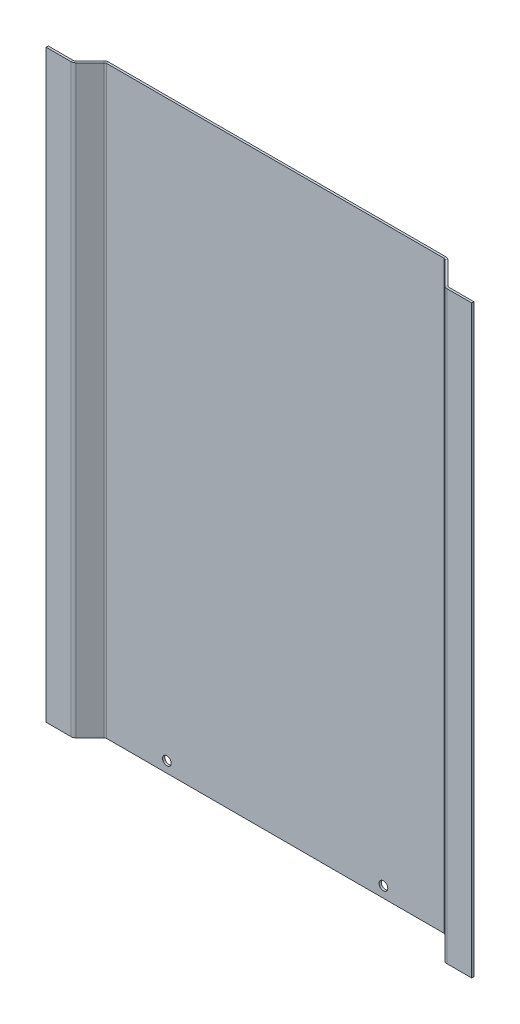
ISO-10303-21;
HEADER;
FILE_DESCRIPTION(('STEP AP214'),'2;1');
FILE_NAME('part.step','',(''),(''),'','','');
FILE_SCHEMA(('AUTOMOTIVE_DESIGN { 1 0 10303 214 1 1 1 1 }'));
ENDSEC;
DATA;
#1=APPLICATION_CONTEXT('core data for automotive mechanical design processes');
#2=APPLICATION_PROTOCOL_DEFINITION('international standard','automotive_design',2000,#1);
#3=PRODUCT_CONTEXT('',#1,'mechanical');
#4=PRODUCT('Part','Part','',(#3));
#5=PRODUCT_RELATED_PRODUCT_CATEGORY('part','',(#4));
#6=PRODUCT_DEFINITION_FORMATION('','',#4);
#7=PRODUCT_DEFINITION_CONTEXT('part definition',#1,'design');
#8=PRODUCT_DEFINITION('design','',#6,#7);
#9=PRODUCT_DEFINITION_SHAPE('','',#8);
#10=(LENGTH_UNIT() NAMED_UNIT(*) SI_UNIT(.MILLI.,.METRE.));
#11=(NAMED_UNIT(*) PLANE_ANGLE_UNIT() SI_UNIT($,.RADIAN.));
#12=(NAMED_UNIT(*) SI_UNIT($,.STERADIAN.) SOLID_ANGLE_UNIT());
#13=UNCERTAINTY_MEASURE_WITH_UNIT(LENGTH_MEASURE(1.E-05),#10,'distance_accuracy_value','');
#14=(GEOMETRIC_REPRESENTATION_CONTEXT(3) GLOBAL_UNCERTAINTY_ASSIGNED_CONTEXT((#13)) GLOBAL_UNIT_ASSIGNED_CONTEXT((#10,
#11,#12)) REPRESENTATION_CONTEXT('',''));
#15=CARTESIAN_POINT('',(0.,0.,0.));
#16=DIRECTION('',(0.,0.,1.));
#17=DIRECTION('',(1.,0.,0.));
#18=AXIS2_PLACEMENT_3D('',#15,#16,#17);
#19=CARTESIAN_POINT('',(-177.752027260435,270.,50.1485281374239));
#20=DIRECTION('',(0.,1.,0.));
#21=DIRECTION('',(0.,0.,1.));
#22=AXIS2_PLACEMENT_3D('',#19,#20,#21);
#23=PLANE('',#22);
#24=DIRECTION('',(0.707106781186547,0.,0.707106781186547));
#25=VECTOR('',#24,1.);
#26=CARTESIAN_POINT('',(-177.752027260435,270.,50.1485281374239));
#27=LINE('',#26,#25);
#28=CARTESIAN_POINT('',(-177.752027260435,270.,50.1485281374239));
#29=VERTEX_POINT('',#28);
#30=CARTESIAN_POINT('',(-177.044920479248,270.,50.8556349186104));
#31=VERTEX_POINT('',#30);
#32=EDGE_CURVE('E11',#29,#31,#27,.T.);
#33=ORIENTED_EDGE('',*,*,#32,.F.);
#34=CARTESIAN_POINT('',(-178.600555397859,270.,49.3));
#35=DIRECTION('',(0.,-1.,0.));
#36=DIRECTION('',(0.,0.,-1.));
#37=AXIS2_PLACEMENT_3D('',#34,#35,#36);
#38=CIRCLE('',#37,1.2);
#39=CARTESIAN_POINT('',(-178.600555397859,270.,50.5));
#40=VERTEX_POINT('',#39);
#41=EDGE_CURVE('E364',#40,#29,#38,.F.);
#42=ORIENTED_EDGE('',*,*,#41,.F.);
#43=DIRECTION('',(0.,0.,-1.));
#44=VECTOR('',#43,1.);
#45=CARTESIAN_POINT('',(-178.600555397859,270.,51.5));
#46=LINE('',#45,#44);
#47=CARTESIAN_POINT('',(-178.600555397859,270.,51.5));
#48=VERTEX_POINT('',#47);
#49=EDGE_CURVE('E42',#48,#40,#46,.T.);
#50=ORIENTED_EDGE('',*,*,#49,.F.);
#51=CARTESIAN_POINT('',(-178.600555397859,270.,49.3));
#52=DIRECTION('',(0.,1.,0.));
#53=DIRECTION('',(1.,0.,0.));
#54=AXIS2_PLACEMENT_3D('',#51,#52,#53);
#55=CIRCLE('',#54,2.2);
#56=EDGE_CURVE('E377',#48,#31,#55,.T.);
#57=ORIENTED_EDGE('',*,*,#56,.T.);
#58=EDGE_LOOP('',(#33,#42,#50,#57));
#59=FACE_BOUND('',#58,.T.);
#60=ADVANCED_FACE('F34',(#59),#23,.T.);
#61=CARTESIAN_POINT('',(-178.600555397859,270.,51.5));
#62=DIRECTION('',(0.,1.,0.));
#63=DIRECTION('',(0.,0.,1.));
#64=AXIS2_PLACEMENT_3D('',#61,#62,#63);
#65=PLANE('',#64);
#66=DIRECTION('',(0.707106781186547,0.,-0.707106781186548));
#67=VECTOR('',#66,1.);
#68=CARTESIAN_POINT('',(-178.103499123011,270.,50.5));
#69=LINE('',#68,#67);
#70=CARTESIAN_POINT('',(-171.247864204401,270.,43.6443650813896));
#71=VERTEX_POINT('',#70);
#72=EDGE_CURVE('E368',#29,#71,#69,.T.);
#73=ORIENTED_EDGE('',*,*,#72,.F.);
#74=ORIENTED_EDGE('',*,*,#32,.T.);
#75=DIRECTION('',(0.707106781186547,0.,-0.707106781186548));
#76=VECTOR('',#75,1.);
#77=CARTESIAN_POINT('',(-177.396392341825,270.,51.2071067811865));
#78=LINE('',#77,#76);
#79=CARTESIAN_POINT('',(-170.540757423214,270.,44.3514718625761));
#80=VERTEX_POINT('',#79);
#81=EDGE_CURVE('E379',#31,#80,#78,.T.);
#82=ORIENTED_EDGE('',*,*,#81,.T.);
#83=DIRECTION('',(-0.707106781186547,0.,-0.707106781186547));
#84=VECTOR('',#83,1.);
#85=CARTESIAN_POINT('',(-170.540757423214,270.,44.3514718625761));
#86=LINE('',#85,#84);
#87=EDGE_CURVE('E338',#80,#71,#86,.T.);
#88=ORIENTED_EDGE('',*,*,#87,.T.);
#89=EDGE_LOOP('',(#73,#74,#82,#88));
#90=FACE_BOUND('',#89,.T.);
#91=ADVANCED_FACE('F449',(#90),#65,.T.);
#92=CARTESIAN_POINT('',(-178.600555397859,0.,50.5));
#93=DIRECTION('',(0.,-1.,0.));
#94=DIRECTION('',(0.,0.,-1.));
#95=AXIS2_PLACEMENT_3D('',#92,#93,#94);
#96=PLANE('',#95);
#97=DIRECTION('',(0.,0.,1.));
#98=VECTOR('',#97,1.);
#99=CARTESIAN_POINT('',(-178.600555397859,0.,50.5));
#100=LINE('',#99,#98);
#101=CARTESIAN_POINT('',(-178.600555397859,0.,50.5));
#102=VERTEX_POINT('',#101);
#103=CARTESIAN_POINT('',(-178.600555397859,0.,51.5));
#104=VERTEX_POINT('',#103);
#105=EDGE_CURVE('E344',#102,#104,#100,.T.);
#106=ORIENTED_EDGE('',*,*,#105,.F.);
#107=CARTESIAN_POINT('',(-178.600555397859,0.,49.3));
#108=DIRECTION('',(0.,-1.,0.));
#109=DIRECTION('',(0.,0.,-1.));
#110=AXIS2_PLACEMENT_3D('',#107,#108,#109);
#111=CIRCLE('',#110,1.2);
#112=CARTESIAN_POINT('',(-177.752027260435,0.,50.1485281374239));
#113=VERTEX_POINT('',#112);
#114=EDGE_CURVE('E248',#102,#113,#111,.F.);
#115=ORIENTED_EDGE('',*,*,#114,.T.);
#116=DIRECTION('',(-0.707106781186547,0.,-0.707106781186547));
#117=VECTOR('',#116,1.);
#118=CARTESIAN_POINT('',(-177.044920479248,0.,50.8556349186104));
#119=LINE('',#118,#117);
#120=CARTESIAN_POINT('',(-177.044920479248,0.,50.8556349186104));
#121=VERTEX_POINT('',#120);
#122=EDGE_CURVE('E342',#121,#113,#119,.T.);
#123=ORIENTED_EDGE('',*,*,#122,.F.);
#124=CARTESIAN_POINT('',(-178.600555397859,0.,49.3));
#125=DIRECTION('',(0.,1.,0.));
#126=DIRECTION('',(1.,0.,0.));
#127=AXIS2_PLACEMENT_3D('',#124,#125,#126);
#128=CIRCLE('',#127,2.2);
#129=EDGE_CURVE('E260',#104,#121,#128,.T.);
#130=ORIENTED_EDGE('',*,*,#129,.F.);
#131=EDGE_LOOP('',(#106,#115,#123,#130));
#132=FACE_BOUND('',#131,.T.);
#133=ADVANCED_FACE('F491',(#132),#96,.T.);
#134=CARTESIAN_POINT('',(-177.044920479248,0.,50.8556349186104));
#135=DIRECTION('',(0.,-1.,0.));
#136=DIRECTION('',(0.,0.,-1.));
#137=AXIS2_PLACEMENT_3D('',#134,#135,#136);
#138=PLANE('',#137);
#139=DIRECTION('',(1.,0.,0.));
#140=VECTOR('',#139,1.);
#141=CARTESIAN_POINT('',(-178.103499123011,0.,50.5));
#142=LINE('',#141,#140);
#143=CARTESIAN_POINT('',(-190.103499123011,0.,50.5));
#144=VERTEX_POINT('',#143);
#145=EDGE_CURVE('E251',#144,#102,#142,.T.);
#146=ORIENTED_EDGE('',*,*,#145,.T.);
#147=ORIENTED_EDGE('',*,*,#105,.T.);
#148=DIRECTION('',(1.,0.,0.));
#149=VECTOR('',#148,1.);
#150=CARTESIAN_POINT('',(-178.103499123011,0.,51.5));
#151=LINE('',#150,#149);
#152=CARTESIAN_POINT('',(-190.103499123011,0.,51.5));
#153=VERTEX_POINT('',#152);
#154=EDGE_CURVE('E257',#153,#104,#151,.T.);
#155=ORIENTED_EDGE('',*,*,#154,.F.);
#156=DIRECTION('',(0.,0.,-1.));
#157=VECTOR('',#156,1.);
#158=CARTESIAN_POINT('',(-190.103499123011,0.,51.5));
#159=LINE('',#158,#157);
#160=EDGE_CURVE('E254',#153,#144,#159,.T.);
#161=ORIENTED_EDGE('',*,*,#160,.T.);
#162=EDGE_LOOP('',(#146,#147,#155,#161));
#163=FACE_BOUND('',#162,.T.);
#164=ADVANCED_FACE('F495',(#163),#138,.T.);
#165=CARTESIAN_POINT('',(-169.69222928579,270.,43.));
#166=DIRECTION('',(0.,1.,0.));
#167=DIRECTION('',(0.,0.,1.));
#168=AXIS2_PLACEMENT_3D('',#165,#166,#167);
#169=PLANE('',#168);
#170=DIRECTION('',(0.,0.,1.));
#171=VECTOR('',#170,1.);
#172=CARTESIAN_POINT('',(-169.69222928579,270.,43.));
#173=LINE('',#172,#171);
#174=CARTESIAN_POINT('',(-169.69222928579,270.,43.));
#175=VERTEX_POINT('',#174);
#176=CARTESIAN_POINT('',(-169.69222928579,270.,44.));
#177=VERTEX_POINT('',#176);
#178=EDGE_CURVE('E340',#175,#177,#173,.T.);
#179=ORIENTED_EDGE('',*,*,#178,.F.);
#180=CARTESIAN_POINT('',(-169.69222928579,270.,45.2));
#181=DIRECTION('',(0.,1.,0.));
#182=DIRECTION('',(0.,0.,1.));
#183=AXIS2_PLACEMENT_3D('',#180,#181,#182);
#184=CIRCLE('',#183,2.2);
#185=EDGE_CURVE('E439',#71,#175,#184,.F.);
#186=ORIENTED_EDGE('',*,*,#185,.F.);
#187=ORIENTED_EDGE('',*,*,#87,.F.);
#188=CARTESIAN_POINT('',(-169.69222928579,270.,45.2));
#189=DIRECTION('',(0.,1.,0.));
#190=DIRECTION('',(1.,0.,0.));
#191=AXIS2_PLACEMENT_3D('',#188,#189,#190);
#192=CIRCLE('',#191,1.2);
#193=EDGE_CURVE('E382',#80,#177,#192,.F.);
#194=ORIENTED_EDGE('',*,*,#193,.T.);
#195=EDGE_LOOP('',(#179,#186,#187,#194));
#196=FACE_BOUND('',#195,.T.);
#197=ADVANCED_FACE('F456',(#196),#169,.T.);
#198=CARTESIAN_POINT('',(-170.540757423214,270.,44.3514718625761));
#199=DIRECTION('',(0.,1.,0.));
#200=DIRECTION('',(0.,0.,1.));
#201=AXIS2_PLACEMENT_3D('',#198,#199,#200);
#202=PLANE('',#201);
#203=DIRECTION('',(1.,0.,0.));
#204=VECTOR('',#203,1.);
#205=CARTESIAN_POINT('',(-170.603499123011,270.,43.));
#206=LINE('',#205,#204);
#207=CARTESIAN_POINT('',(-14.0071930094071,270.,43.));
#208=VERTEX_POINT('',#207);
#209=EDGE_CURVE('E436',#175,#208,#206,.T.);
#210=ORIENTED_EDGE('',*,*,#209,.F.);
#211=ORIENTED_EDGE('',*,*,#178,.T.);
#212=DIRECTION('',(1.,0.,0.));
#213=VECTOR('',#212,1.);
#214=CARTESIAN_POINT('',(-170.603499123011,270.,44.));
#215=LINE('',#214,#213);
#216=CARTESIAN_POINT('',(-14.0071930094071,270.,44.));
#217=VERTEX_POINT('',#216);
#218=EDGE_CURVE('E201',#177,#217,#215,.T.);
#219=ORIENTED_EDGE('',*,*,#218,.T.);
#220=DIRECTION('',(0.,0.,-1.));
#221=VECTOR('',#220,1.);
#222=CARTESIAN_POINT('',(-14.0071930094071,270.,44.));
#223=LINE('',#222,#221);
#224=EDGE_CURVE('E192',#217,#208,#223,.T.);
#225=ORIENTED_EDGE('',*,*,#224,.T.);
#226=EDGE_LOOP('',(#210,#211,#219,#225));
#227=FACE_BOUND('',#226,.T.);
#228=ADVANCED_FACE('F388',(#227),#202,.T.);
#229=CARTESIAN_POINT('',(-171.247864204401,0.,43.6443650813896));
#230=DIRECTION('',(0.,-1.,0.));
#231=DIRECTION('',(0.,0.,-1.));
#232=AXIS2_PLACEMENT_3D('',#229,#230,#231);
#233=PLANE('',#232);
#234=DIRECTION('',(0.707106781186547,0.,0.707106781186547));
#235=VECTOR('',#234,1.);
#236=CARTESIAN_POINT('',(-171.247864204401,0.,43.6443650813896));
#237=LINE('',#236,#235);
#238=CARTESIAN_POINT('',(-171.247864204401,0.,43.6443650813896));
#239=VERTEX_POINT('',#238);
#240=CARTESIAN_POINT('',(-170.540757423214,0.,44.3514718625761));
#241=VERTEX_POINT('',#240);
#242=EDGE_CURVE('E336',#239,#241,#237,.T.);
#243=ORIENTED_EDGE('',*,*,#242,.F.);
#244=CARTESIAN_POINT('',(-169.69222928579,0.,45.2));
#245=DIRECTION('',(0.,1.,0.));
#246=DIRECTION('',(0.,0.,1.));
#247=AXIS2_PLACEMENT_3D('',#244,#245,#246);
#248=CIRCLE('',#247,2.2);
#249=CARTESIAN_POINT('',(-169.69222928579,0.,43.));
#250=VERTEX_POINT('',#249);
#251=EDGE_CURVE('E242',#239,#250,#248,.F.);
#252=ORIENTED_EDGE('',*,*,#251,.T.);
#253=DIRECTION('',(0.,0.,-1.));
#254=VECTOR('',#253,1.);
#255=CARTESIAN_POINT('',(-169.69222928579,0.,44.));
#256=LINE('',#255,#254);
#257=CARTESIAN_POINT('',(-169.69222928579,0.,44.));
#258=VERTEX_POINT('',#257);
#259=EDGE_CURVE('E191',#258,#250,#256,.T.);
#260=ORIENTED_EDGE('',*,*,#259,.F.);
#261=CARTESIAN_POINT('',(-169.69222928579,0.,45.2));
#262=DIRECTION('',(0.,1.,0.));
#263=DIRECTION('',(1.,0.,0.));
#264=AXIS2_PLACEMENT_3D('',#261,#262,#263);
#265=CIRCLE('',#264,1.2);
#266=EDGE_CURVE('E266',#241,#258,#265,.F.);
#267=ORIENTED_EDGE('',*,*,#266,.F.);
#268=EDGE_LOOP('',(#243,#252,#260,#267));
#269=FACE_BOUND('',#268,.T.);
#270=ADVANCED_FACE('F465',(#269),#233,.T.);
#271=CARTESIAN_POINT('',(-169.69222928579,0.,44.));
#272=DIRECTION('',(0.,-1.,0.));
#273=DIRECTION('',(0.,0.,-1.));
#274=AXIS2_PLACEMENT_3D('',#271,#272,#273);
#275=PLANE('',#274);
#276=DIRECTION('',(0.707106781186547,0.,-0.707106781186548));
#277=VECTOR('',#276,1.);
#278=CARTESIAN_POINT('',(-178.103499123011,0.,50.5));
#279=LINE('',#278,#277);
#280=EDGE_CURVE('E245',#113,#239,#279,.T.);
#281=ORIENTED_EDGE('',*,*,#280,.T.);
#282=ORIENTED_EDGE('',*,*,#242,.T.);
#283=DIRECTION('',(0.707106781186547,0.,-0.707106781186548));
#284=VECTOR('',#283,1.);
#285=CARTESIAN_POINT('',(-177.396392341825,0.,51.2071067811865));
#286=LINE('',#285,#284);
#287=EDGE_CURVE('E263',#121,#241,#286,.T.);
#288=ORIENTED_EDGE('',*,*,#287,.F.);
#289=ORIENTED_EDGE('',*,*,#122,.T.);
#290=EDGE_LOOP('',(#281,#282,#288,#289));
#291=FACE_BOUND('',#290,.T.);
#292=ADVANCED_FACE('F469',(#291),#275,.T.);
#293=CARTESIAN_POINT('',(-12.4515580907966,270.,43.6443650813895));
#294=DIRECTION('',(0.,1.,0.));
#295=DIRECTION('',(0.,0.,1.));
#296=AXIS2_PLACEMENT_3D('',#293,#294,#295);
#297=PLANE('',#296);
#298=DIRECTION('',(-0.707106781186549,0.,0.707106781186546));
#299=VECTOR('',#298,1.);
#300=CARTESIAN_POINT('',(-12.4515580907966,270.,43.6443650813895));
#301=LINE('',#300,#299);
#302=CARTESIAN_POINT('',(-12.4515580907966,270.,43.6443650813895));
#303=VERTEX_POINT('',#302);
#304=CARTESIAN_POINT('',(-13.1586648719831,270.,44.3514718625761));
#305=VERTEX_POINT('',#304);
#306=EDGE_CURVE('E179',#303,#305,#301,.T.);
#307=ORIENTED_EDGE('',*,*,#306,.F.);
#308=CARTESIAN_POINT('',(-14.007193009407,270.,45.2));
#309=DIRECTION('',(0.,1.,0.));
#310=DIRECTION('',(0.,0.,1.));
#311=AXIS2_PLACEMENT_3D('',#308,#309,#310);
#312=CIRCLE('',#311,2.2);
#313=EDGE_CURVE('E400',#208,#303,#312,.F.);
#314=ORIENTED_EDGE('',*,*,#313,.F.);
#315=ORIENTED_EDGE('',*,*,#224,.F.);
#316=CARTESIAN_POINT('',(-14.007193009407,270.,45.2));
#317=DIRECTION('',(0.,1.,0.));
#318=DIRECTION('',(1.,0.,0.));
#319=AXIS2_PLACEMENT_3D('',#316,#317,#318);
#320=CIRCLE('',#319,1.2);
#321=EDGE_CURVE('E195',#217,#305,#320,.F.);
#322=ORIENTED_EDGE('',*,*,#321,.T.);
#323=EDGE_LOOP('',(#307,#314,#315,#322));
#324=FACE_BOUND('',#323,.T.);
#325=ADVANCED_FACE('F197',(#324),#297,.T.);
#326=CARTESIAN_POINT('',(-14.0071930094071,270.,44.));
#327=DIRECTION('',(0.,1.,0.));
#328=DIRECTION('',(0.,0.,1.));
#329=AXIS2_PLACEMENT_3D('',#326,#327,#328);
#330=PLANE('',#329);
#331=DIRECTION('',(0.707106781186547,0.,0.707106781186548));
#332=VECTOR('',#331,1.);
#333=CARTESIAN_POINT('',(-13.0959231721861,270.,43.));
#334=LINE('',#333,#332);
#335=CARTESIAN_POINT('',(-1.94739503476221,270.,54.1485281374239));
#336=VERTEX_POINT('',#335);
#337=EDGE_CURVE('E186',#303,#336,#334,.T.);
#338=ORIENTED_EDGE('',*,*,#337,.F.);
#339=ORIENTED_EDGE('',*,*,#306,.T.);
#340=DIRECTION('',(0.707106781186547,0.,0.707106781186548));
#341=VECTOR('',#340,1.);
#342=CARTESIAN_POINT('',(-13.8030299533727,270.,43.7071067811865));
#343=LINE('',#342,#341);
#344=CARTESIAN_POINT('',(-2.65450181594875,270.,54.8556349186105));
#345=VERTEX_POINT('',#344);
#346=EDGE_CURVE('E183',#305,#345,#343,.T.);
#347=ORIENTED_EDGE('',*,*,#346,.T.);
#348=DIRECTION('',(0.707106781186548,0.,-0.707106781186547));
#349=VECTOR('',#348,1.);
#350=CARTESIAN_POINT('',(-2.65450181594875,270.,54.8556349186105));
#351=LINE('',#350,#349);
#352=EDGE_CURVE('E327',#345,#336,#351,.T.);
#353=ORIENTED_EDGE('',*,*,#352,.T.);
#354=EDGE_LOOP('',(#338,#339,#347,#353));
#355=FACE_BOUND('',#354,.T.);
#356=ADVANCED_FACE('F181',(#355),#330,.T.);
#357=CARTESIAN_POINT('',(-14.0071930094071,0.,43.));
#358=DIRECTION('',(0.,-1.,0.));
#359=DIRECTION('',(0.,0.,-1.));
#360=AXIS2_PLACEMENT_3D('',#357,#358,#359);
#361=PLANE('',#360);
#362=DIRECTION('',(0.,0.,1.));
#363=VECTOR('',#362,1.);
#364=CARTESIAN_POINT('',(-14.0071930094071,0.,43.));
#365=LINE('',#364,#363);
#366=CARTESIAN_POINT('',(-14.0071930094071,0.,43.));
#367=VERTEX_POINT('',#366);
#368=CARTESIAN_POINT('',(-14.0071930094071,0.,44.));
#369=VERTEX_POINT('',#368);
#370=EDGE_CURVE('E332',#367,#369,#365,.T.);
#371=ORIENTED_EDGE('',*,*,#370,.F.);
#372=CARTESIAN_POINT('',(-14.007193009407,0.,45.2));
#373=DIRECTION('',(0.,1.,0.));
#374=DIRECTION('',(0.,0.,1.));
#375=AXIS2_PLACEMENT_3D('',#372,#373,#374);
#376=CIRCLE('',#375,2.2);
#377=CARTESIAN_POINT('',(-12.4515580907966,0.,43.6443650813895));
#378=VERTEX_POINT('',#377);
#379=EDGE_CURVE('E236',#367,#378,#376,.F.);
#380=ORIENTED_EDGE('',*,*,#379,.T.);
#381=DIRECTION('',(0.707106781186549,0.,-0.707106781186546));
#382=VECTOR('',#381,1.);
#383=CARTESIAN_POINT('',(-13.1586648719831,0.,44.3514718625761));
#384=LINE('',#383,#382);
#385=CARTESIAN_POINT('',(-13.1586648719831,0.,44.3514718625761));
#386=VERTEX_POINT('',#385);
#387=EDGE_CURVE('E330',#386,#378,#384,.T.);
#388=ORIENTED_EDGE('',*,*,#387,.F.);
#389=CARTESIAN_POINT('',(-14.007193009407,0.,45.2));
#390=DIRECTION('',(0.,1.,0.));
#391=DIRECTION('',(1.,0.,0.));
#392=AXIS2_PLACEMENT_3D('',#389,#390,#391);
#393=CIRCLE('',#392,1.2);
#394=EDGE_CURVE('E208',#369,#386,#393,.F.);
#395=ORIENTED_EDGE('',*,*,#394,.F.);
#396=EDGE_LOOP('',(#371,#380,#388,#395));
#397=FACE_BOUND('',#396,.T.);
#398=ADVANCED_FACE('F394',(#397),#361,.T.);
#399=CARTESIAN_POINT('',(-13.1586648719831,0.,44.3514718625761));
#400=DIRECTION('',(0.,-1.,0.));
#401=DIRECTION('',(0.,0.,-1.));
#402=AXIS2_PLACEMENT_3D('',#399,#400,#401);
#403=PLANE('',#402);
#404=DIRECTION('',(1.,0.,0.));
#405=VECTOR('',#404,1.);
#406=CARTESIAN_POINT('',(-170.603499123011,0.,43.));
#407=LINE('',#406,#405);
#408=EDGE_CURVE('E239',#250,#367,#407,.T.);
#409=ORIENTED_EDGE('',*,*,#408,.T.);
#410=ORIENTED_EDGE('',*,*,#370,.T.);
#411=DIRECTION('',(1.,0.,0.));
#412=VECTOR('',#411,1.);
#413=CARTESIAN_POINT('',(-170.603499123011,0.,44.));
#414=LINE('',#413,#412);
#415=EDGE_CURVE('E269',#258,#369,#414,.T.);
#416=ORIENTED_EDGE('',*,*,#415,.F.);
#417=ORIENTED_EDGE('',*,*,#259,.T.);
#418=EDGE_LOOP('',(#409,#410,#416,#417));
#419=FACE_BOUND('',#418,.T.);
#420=ADVANCED_FACE('F475',(#419),#403,.T.);
#421=CARTESIAN_POINT('',(-1.09886689733835,270.,54.5000000000001));
#422=DIRECTION('',(0.,1.,0.));
#423=DIRECTION('',(0.,0.,1.));
#424=AXIS2_PLACEMENT_3D('',#421,#422,#423);
#425=PLANE('',#424);
#426=DIRECTION('',(0.,0.,1.));
#427=VECTOR('',#426,1.);
#428=CARTESIAN_POINT('',(-1.09886689733835,270.,54.5000000000001));
#429=LINE('',#428,#427);
#430=CARTESIAN_POINT('',(-1.09886689733835,270.,54.5000000000001));
#431=VERTEX_POINT('',#430);
#432=CARTESIAN_POINT('',(-1.09886689733835,270.,55.5000000000001));
#433=VERTEX_POINT('',#432);
#434=EDGE_CURVE('E50',#431,#433,#429,.T.);
#435=ORIENTED_EDGE('',*,*,#434,.F.);
#436=CARTESIAN_POINT('',(-1.09886689733835,270.,53.3000000000001));
#437=DIRECTION('',(0.,-1.,0.));
#438=DIRECTION('',(0.,0.,-1.));
#439=AXIS2_PLACEMENT_3D('',#436,#437,#438);
#440=CIRCLE('',#439,1.2);
#441=EDGE_CURVE('E428',#336,#431,#440,.F.);
#442=ORIENTED_EDGE('',*,*,#441,.F.);
#443=ORIENTED_EDGE('',*,*,#352,.F.);
#444=CARTESIAN_POINT('',(-1.09886689733835,270.,53.3000000000001));
#445=DIRECTION('',(0.,1.,0.));
#446=DIRECTION('',(1.,0.,0.));
#447=AXIS2_PLACEMENT_3D('',#444,#445,#446);
#448=CIRCLE('',#447,2.2);
#449=EDGE_CURVE('E216',#345,#433,#448,.T.);
#450=ORIENTED_EDGE('',*,*,#449,.T.);
#451=EDGE_LOOP('',(#435,#442,#443,#450));
#452=FACE_BOUND('',#451,.T.);
#453=ADVANCED_FACE('F477',(#452),#425,.T.);
#454=CARTESIAN_POINT('',(-2.65450181594875,270.,54.8556349186105));
#455=DIRECTION('',(0.,1.,0.));
#456=DIRECTION('',(0.,0.,1.));
#457=AXIS2_PLACEMENT_3D('',#454,#455,#456);
#458=PLANE('',#457);
#459=DIRECTION('',(1.,0.,0.));
#460=VECTOR('',#459,1.);
#461=CARTESIAN_POINT('',(-1.59592317218606,270.,54.5000000000001));
#462=LINE('',#461,#460);
#463=CARTESIAN_POINT('',(10.4040768278139,270.,54.5000000000001));
#464=VERTEX_POINT('',#463);
#465=EDGE_CURVE('E426',#431,#464,#462,.T.);
#466=ORIENTED_EDGE('',*,*,#465,.F.);
#467=ORIENTED_EDGE('',*,*,#434,.T.);
#468=DIRECTION('',(1.,0.,0.));
#469=VECTOR('',#468,1.);
#470=CARTESIAN_POINT('',(-1.59592317218606,270.,55.5000000000001));
#471=LINE('',#470,#469);
#472=CARTESIAN_POINT('',(10.4040768278139,270.,55.5000000000001));
#473=VERTEX_POINT('',#472);
#474=EDGE_CURVE('E128',#433,#473,#471,.T.);
#475=ORIENTED_EDGE('',*,*,#474,.T.);
#476=DIRECTION('',(0.,0.,1.));
#477=VECTOR('',#476,1.);
#478=CARTESIAN_POINT('',(10.4040768278139,270.,54.5000000000001));
#479=LINE('',#478,#477);
#480=EDGE_CURVE('E424',#464,#473,#479,.T.);
#481=ORIENTED_EDGE('',*,*,#480,.F.);
#482=EDGE_LOOP('',(#466,#467,#475,#481));
#483=FACE_BOUND('',#482,.T.);
#484=ADVANCED_FACE('F483',(#483),#458,.T.);
#485=CARTESIAN_POINT('',(-1.94739503476221,0.,54.1485281374239));
#486=DIRECTION('',(0.,-1.,0.));
#487=DIRECTION('',(0.,0.,-1.));
#488=AXIS2_PLACEMENT_3D('',#485,#486,#487);
#489=PLANE('',#488);
#490=DIRECTION('',(-0.707106781186548,0.,0.707106781186547));
#491=VECTOR('',#490,1.);
#492=CARTESIAN_POINT('',(-1.94739503476221,0.,54.1485281374239));
#493=LINE('',#492,#491);
#494=CARTESIAN_POINT('',(-1.94739503476221,0.,54.1485281374239));
#495=VERTEX_POINT('',#494);
#496=CARTESIAN_POINT('',(-2.65450181594875,0.,54.8556349186105));
#497=VERTEX_POINT('',#496);
#498=EDGE_CURVE('E115',#495,#497,#493,.T.);
#499=ORIENTED_EDGE('',*,*,#498,.F.);
#500=CARTESIAN_POINT('',(-1.09886689733835,0.,53.3000000000001));
#501=DIRECTION('',(0.,-1.,0.));
#502=DIRECTION('',(0.,0.,-1.));
#503=AXIS2_PLACEMENT_3D('',#500,#501,#502);
#504=CIRCLE('',#503,1.2);
#505=CARTESIAN_POINT('',(-1.09886689733835,0.,54.5000000000001));
#506=VERTEX_POINT('',#505);
#507=EDGE_CURVE('E232',#495,#506,#504,.F.);
#508=ORIENTED_EDGE('',*,*,#507,.T.);
#509=DIRECTION('',(0.,0.,-1.));
#510=VECTOR('',#509,1.);
#511=CARTESIAN_POINT('',(-1.09886689733835,0.,55.5000000000001));
#512=LINE('',#511,#510);
#513=CARTESIAN_POINT('',(-1.09886689733835,0.,55.5000000000001));
#514=VERTEX_POINT('',#513);
#515=EDGE_CURVE('E122',#514,#506,#512,.T.);
#516=ORIENTED_EDGE('',*,*,#515,.F.);
#517=CARTESIAN_POINT('',(-1.09886689733835,0.,53.3000000000001));
#518=DIRECTION('',(0.,1.,0.));
#519=DIRECTION('',(1.,0.,0.));
#520=AXIS2_PLACEMENT_3D('',#517,#518,#519);
#521=CIRCLE('',#520,2.2);
#522=EDGE_CURVE('E275',#497,#514,#521,.T.);
#523=ORIENTED_EDGE('',*,*,#522,.F.);
#524=EDGE_LOOP('',(#499,#508,#516,#523));
#525=FACE_BOUND('',#524,.T.);
#526=ADVANCED_FACE('F411',(#525),#489,.T.);
#527=CARTESIAN_POINT('',(-1.09886689733835,0.,55.5000000000001));
#528=DIRECTION('',(0.,-1.,0.));
#529=DIRECTION('',(0.,0.,-1.));
#530=AXIS2_PLACEMENT_3D('',#527,#528,#529);
#531=PLANE('',#530);
#532=DIRECTION('',(0.707106781186547,0.,0.707106781186548));
#533=VECTOR('',#532,1.);
#534=CARTESIAN_POINT('',(-13.0959231721861,0.,43.));
#535=LINE('',#534,#533);
#536=EDGE_CURVE('E234',#378,#495,#535,.T.);
#537=ORIENTED_EDGE('',*,*,#536,.T.);
#538=ORIENTED_EDGE('',*,*,#498,.T.);
#539=DIRECTION('',(0.707106781186547,0.,0.707106781186548));
#540=VECTOR('',#539,1.);
#541=CARTESIAN_POINT('',(-13.8030299533727,0.,43.7071067811865));
#542=LINE('',#541,#540);
#543=EDGE_CURVE('E273',#386,#497,#542,.T.);
#544=ORIENTED_EDGE('',*,*,#543,.F.);
#545=ORIENTED_EDGE('',*,*,#387,.T.);
#546=EDGE_LOOP('',(#537,#538,#544,#545));
#547=FACE_BOUND('',#546,.T.);
#548=ADVANCED_FACE('F396',(#547),#531,.T.);
#549=CARTESIAN_POINT('',(-1.59592317218606,270.,55.5000000000001));
#550=DIRECTION('',(0.,0.,-1.));
#551=DIRECTION('',(-1.,0.,0.));
#552=AXIS2_PLACEMENT_3D('',#549,#550,#551);
#553=PLANE('',#552);
#554=DIRECTION('',(1.,0.,0.));
#555=VECTOR('',#554,1.);
#556=CARTESIAN_POINT('',(-1.59592317218606,0.,55.5000000000001));
#557=LINE('',#556,#555);
#558=CARTESIAN_POINT('',(10.4040768278139,0.,55.5000000000001));
#559=VERTEX_POINT('',#558);
#560=EDGE_CURVE('E222',#514,#559,#557,.T.);
#561=ORIENTED_EDGE('',*,*,#560,.T.);
#562=DIRECTION('',(0.,-1.,0.));
#563=VECTOR('',#562,1.);
#564=CARTESIAN_POINT('',(10.4040768278139,270.,55.5000000000001));
#565=LINE('',#564,#563);
#566=EDGE_CURVE('E323',#473,#559,#565,.T.);
#567=ORIENTED_EDGE('',*,*,#566,.F.);
#568=ORIENTED_EDGE('',*,*,#474,.F.);
#569=DIRECTION('',(0.,-1.,0.));
#570=VECTOR('',#569,1.);
#571=CARTESIAN_POINT('',(-1.09886689733835,270.,55.5000000000001));
#572=LINE('',#571,#570);
#573=EDGE_CURVE('E218',#433,#514,#572,.T.);
#574=ORIENTED_EDGE('',*,*,#573,.T.);
#575=EDGE_LOOP('',(#561,#567,#568,#574));
#576=FACE_BOUND('',#575,.T.);
#577=ADVANCED_FACE('F417',(#576),#553,.F.);
#578=CARTESIAN_POINT('',(10.4040768278139,270.,54.5000000000001));
#579=DIRECTION('',(1.,0.,0.));
#580=DIRECTION('',(0.,0.,-1.));
#581=AXIS2_PLACEMENT_3D('',#578,#579,#580);
#582=PLANE('',#581);
#583=DIRECTION('',(0.,0.,1.));
#584=VECTOR('',#583,1.);
#585=CARTESIAN_POINT('',(10.4040768278139,0.,54.5000000000001));
#586=LINE('',#585,#584);
#587=CARTESIAN_POINT('',(10.4040768278139,0.,54.5000000000001));
#588=VERTEX_POINT('',#587);
#589=EDGE_CURVE('E225',#588,#559,#586,.T.);
#590=ORIENTED_EDGE('',*,*,#589,.F.);
#591=DIRECTION('',(0.,-1.,0.));
#592=VECTOR('',#591,1.);
#593=CARTESIAN_POINT('',(10.4040768278139,270.,54.5000000000001));
#594=LINE('',#593,#592);
#595=EDGE_CURVE('E321',#464,#588,#594,.T.);
#596=ORIENTED_EDGE('',*,*,#595,.F.);
#597=ORIENTED_EDGE('',*,*,#480,.T.);
#598=ORIENTED_EDGE('',*,*,#566,.T.);
#599=EDGE_LOOP('',(#590,#596,#597,#598));
#600=FACE_BOUND('',#599,.T.);
#601=ADVANCED_FACE('F422',(#600),#582,.T.);
#602=CARTESIAN_POINT('',(-1.59592317218606,270.,54.5000000000001));
#603=DIRECTION('',(0.,0.,-1.));
#604=DIRECTION('',(-1.,0.,0.));
#605=AXIS2_PLACEMENT_3D('',#602,#603,#604);
#606=PLANE('',#605);
#607=DIRECTION('',(1.,0.,0.));
#608=VECTOR('',#607,1.);
#609=CARTESIAN_POINT('',(-1.59592317218606,0.,54.5000000000001));
#610=LINE('',#609,#608);
#611=EDGE_CURVE('E229',#506,#588,#610,.T.);
#612=ORIENTED_EDGE('',*,*,#611,.F.);
#613=DIRECTION('',(0.,-1.,0.));
#614=VECTOR('',#613,1.);
#615=CARTESIAN_POINT('',(-1.09886689733835,270.,54.5000000000001));
#616=LINE('',#615,#614);
#617=EDGE_CURVE('E318',#431,#506,#616,.T.);
#618=ORIENTED_EDGE('',*,*,#617,.F.);
#619=ORIENTED_EDGE('',*,*,#465,.T.);
#620=ORIENTED_EDGE('',*,*,#595,.T.);
#621=EDGE_LOOP('',(#612,#618,#619,#620));
#622=FACE_BOUND('',#621,.T.);
#623=ADVANCED_FACE('F579',(#622),#606,.T.);
#624=CARTESIAN_POINT('',(-1.09886689733835,270.,53.3000000000001));
#625=DIRECTION('',(0.,-1.,0.));
#626=DIRECTION('',(0.,0.,-1.));
#627=AXIS2_PLACEMENT_3D('',#624,#625,#626);
#628=CYLINDRICAL_SURFACE('',#627,1.2);
#629=ORIENTED_EDGE('',*,*,#507,.F.);
#630=DIRECTION('',(0.,-1.,0.));
#631=VECTOR('',#630,1.);
#632=CARTESIAN_POINT('',(-1.94739503476221,270.,54.1485281374239));
#633=LINE('',#632,#631);
#634=EDGE_CURVE('E315',#336,#495,#633,.T.);
#635=ORIENTED_EDGE('',*,*,#634,.F.);
#636=ORIENTED_EDGE('',*,*,#441,.T.);
#637=ORIENTED_EDGE('',*,*,#617,.T.);
#638=EDGE_LOOP('',(#629,#635,#636,#637));
#639=FACE_BOUND('',#638,.T.);
#640=ADVANCED_FACE('F408',(#639),#628,.F.);
#641=CARTESIAN_POINT('',(-13.0959231721861,270.,43.));
#642=DIRECTION('',(0.707106781186548,0.,-0.707106781186547));
#643=DIRECTION('',(-0.707106781186547,0.,-0.707106781186548));
#644=AXIS2_PLACEMENT_3D('',#641,#642,#643);
#645=PLANE('',#644);
#646=ORIENTED_EDGE('',*,*,#536,.F.);
#647=DIRECTION('',(0.,-1.,0.));
#648=VECTOR('',#647,1.);
#649=CARTESIAN_POINT('',(-12.4515580907966,270.,43.6443650813895));
#650=LINE('',#649,#648);
#651=EDGE_CURVE('E312',#303,#378,#650,.T.);
#652=ORIENTED_EDGE('',*,*,#651,.F.);
#653=ORIENTED_EDGE('',*,*,#337,.T.);
#654=ORIENTED_EDGE('',*,*,#634,.T.);
#655=EDGE_LOOP('',(#646,#652,#653,#654));
#656=FACE_BOUND('',#655,.T.);
#657=ADVANCED_FACE('F402',(#656),#645,.T.);
#658=CARTESIAN_POINT('',(-14.007193009407,270.,45.2));
#659=DIRECTION('',(0.,-1.,0.));
#660=DIRECTION('',(0.,0.,-1.));
#661=AXIS2_PLACEMENT_3D('',#658,#659,#660);
#662=CYLINDRICAL_SURFACE('',#661,2.2);
#663=ORIENTED_EDGE('',*,*,#379,.F.);
#664=DIRECTION('',(0.,-1.,0.));
#665=VECTOR('',#664,1.);
#666=CARTESIAN_POINT('',(-14.0071930094071,270.,43.));
#667=LINE('',#666,#665);
#668=EDGE_CURVE('E309',#208,#367,#667,.T.);
#669=ORIENTED_EDGE('',*,*,#668,.F.);
#670=ORIENTED_EDGE('',*,*,#313,.T.);
#671=ORIENTED_EDGE('',*,*,#651,.T.);
#672=EDGE_LOOP('',(#663,#669,#670,#671));
#673=FACE_BOUND('',#672,.T.);
#674=ADVANCED_FACE('F399',(#673),#662,.T.);
#675=CARTESIAN_POINT('',(-170.603499123011,270.,43.));
#676=DIRECTION('',(0.,0.,-1.));
#677=DIRECTION('',(-1.,0.,0.));
#678=AXIS2_PLACEMENT_3D('',#675,#676,#677);
#679=PLANE('',#678);
#680=CARTESIAN_POINT('',(-41.8497111475987,5.00000000000001,43.));
#681=DIRECTION('',(0.,0.,-1.));
#682=DIRECTION('',(-1.,0.,0.));
#683=AXIS2_PLACEMENT_3D('',#680,#681,#682);
#684=CIRCLE('',#683,2.);
#685=CARTESIAN_POINT('',(-43.8497111475987,5.00000000000001,43.));
#686=VERTEX_POINT('',#685);
#687=EDGE_CURVE('E796',#686,#686,#684,.T.);
#688=ORIENTED_EDGE('',*,*,#687,.F.);
#689=EDGE_LOOP('',(#688));
#690=FACE_BOUND('',#689,.T.);
#691=CARTESIAN_POINT('',(-141.849711147599,5.,43.));
#692=DIRECTION('',(0.,0.,-1.));
#693=DIRECTION('',(-1.,0.,0.));
#694=AXIS2_PLACEMENT_3D('',#691,#692,#693);
#695=CIRCLE('',#694,2.);
#696=CARTESIAN_POINT('',(-143.849711147599,5.,43.));
#697=VERTEX_POINT('',#696);
#698=EDGE_CURVE('E226',#697,#697,#695,.T.);
#699=ORIENTED_EDGE('',*,*,#698,.F.);
#700=EDGE_LOOP('',(#699));
#701=FACE_BOUND('',#700,.T.);
#702=ORIENTED_EDGE('',*,*,#408,.F.);
#703=DIRECTION('',(0.,-1.,0.));
#704=VECTOR('',#703,1.);
#705=CARTESIAN_POINT('',(-169.69222928579,270.,43.));
#706=LINE('',#705,#704);
#707=EDGE_CURVE('E306',#175,#250,#706,.T.);
#708=ORIENTED_EDGE('',*,*,#707,.F.);
#709=ORIENTED_EDGE('',*,*,#209,.T.);
#710=ORIENTED_EDGE('',*,*,#668,.T.);
#711=EDGE_LOOP('',(#702,#708,#709,#710));
#712=FACE_BOUND('',#711,.T.);
#713=ADVANCED_FACE('F462',(#690,#701,#712),#679,.T.);
#714=CARTESIAN_POINT('',(-169.69222928579,270.,45.2));
#715=DIRECTION('',(0.,-1.,0.));
#716=DIRECTION('',(0.,0.,-1.));
#717=AXIS2_PLACEMENT_3D('',#714,#715,#716);
#718=CYLINDRICAL_SURFACE('',#717,2.2);
#719=ORIENTED_EDGE('',*,*,#251,.F.);
#720=DIRECTION('',(0.,-1.,0.));
#721=VECTOR('',#720,1.);
#722=CARTESIAN_POINT('',(-171.247864204401,270.,43.6443650813896));
#723=LINE('',#722,#721);
#724=EDGE_CURVE('E303',#71,#239,#723,.T.);
#725=ORIENTED_EDGE('',*,*,#724,.F.);
#726=ORIENTED_EDGE('',*,*,#185,.T.);
#727=ORIENTED_EDGE('',*,*,#707,.T.);
#728=EDGE_LOOP('',(#719,#725,#726,#727));
#729=FACE_BOUND('',#728,.T.);
#730=ADVANCED_FACE('F455',(#729),#718,.T.);
#731=CARTESIAN_POINT('',(-178.103499123011,270.,50.5));
#732=DIRECTION('',(-0.707106781186548,0.,-0.707106781186547));
#733=DIRECTION('',(-0.707106781186547,0.,0.707106781186548));
#734=AXIS2_PLACEMENT_3D('',#731,#732,#733);
#735=PLANE('',#734);
#736=ORIENTED_EDGE('',*,*,#280,.F.);
#737=DIRECTION('',(0.,-1.,0.));
#738=VECTOR('',#737,1.);
#739=CARTESIAN_POINT('',(-177.752027260435,270.,50.1485281374239));
#740=LINE('',#739,#738);
#741=EDGE_CURVE('E300',#29,#113,#740,.T.);
#742=ORIENTED_EDGE('',*,*,#741,.F.);
#743=ORIENTED_EDGE('',*,*,#72,.T.);
#744=ORIENTED_EDGE('',*,*,#724,.T.);
#745=EDGE_LOOP('',(#736,#742,#743,#744));
#746=FACE_BOUND('',#745,.T.);
#747=ADVANCED_FACE('F445',(#746),#735,.T.);
#748=CARTESIAN_POINT('',(-178.600555397859,270.,49.3));
#749=DIRECTION('',(0.,-1.,0.));
#750=DIRECTION('',(0.,0.,-1.));
#751=AXIS2_PLACEMENT_3D('',#748,#749,#750);
#752=CYLINDRICAL_SURFACE('',#751,1.2);
#753=ORIENTED_EDGE('',*,*,#114,.F.);
#754=DIRECTION('',(0.,-1.,0.));
#755=VECTOR('',#754,1.);
#756=CARTESIAN_POINT('',(-178.600555397859,270.,50.5));
#757=LINE('',#756,#755);
#758=EDGE_CURVE('E297',#40,#102,#757,.T.);
#759=ORIENTED_EDGE('',*,*,#758,.F.);
#760=ORIENTED_EDGE('',*,*,#41,.T.);
#761=ORIENTED_EDGE('',*,*,#741,.T.);
#762=EDGE_LOOP('',(#753,#759,#760,#761));
#763=FACE_BOUND('',#762,.T.);
#764=ADVANCED_FACE('F363',(#763),#752,.F.);
#765=CARTESIAN_POINT('',(-178.103499123011,270.,50.5));
#766=DIRECTION('',(0.,0.,-1.));
#767=DIRECTION('',(-1.,0.,0.));
#768=AXIS2_PLACEMENT_3D('',#765,#766,#767);
#769=PLANE('',#768);
#770=ORIENTED_EDGE('',*,*,#145,.F.);
#771=DIRECTION('',(0.,-1.,0.));
#772=VECTOR('',#771,1.);
#773=CARTESIAN_POINT('',(-190.103499123011,270.,50.5));
#774=LINE('',#773,#772);
#775=CARTESIAN_POINT('',(-190.103499123011,270.,50.5));
#776=VERTEX_POINT('',#775);
#777=EDGE_CURVE('E295',#776,#144,#774,.T.);
#778=ORIENTED_EDGE('',*,*,#777,.F.);
#779=DIRECTION('',(1.,0.,0.));
#780=VECTOR('',#779,1.);
#781=CARTESIAN_POINT('',(-178.103499123011,270.,50.5));
#782=LINE('',#781,#780);
#783=EDGE_CURVE('E352',#776,#40,#782,.T.);
#784=ORIENTED_EDGE('',*,*,#783,.T.);
#785=ORIENTED_EDGE('',*,*,#758,.T.);
#786=EDGE_LOOP('',(#770,#778,#784,#785));
#787=FACE_BOUND('',#786,.T.);
#788=ADVANCED_FACE('F370',(#787),#769,.T.);
#789=CARTESIAN_POINT('',(-190.103499123011,270.,51.5));
#790=DIRECTION('',(-1.,0.,0.));
#791=DIRECTION('',(0.,0.,1.));
#792=AXIS2_PLACEMENT_3D('',#789,#790,#791);
#793=PLANE('',#792);
#794=ORIENTED_EDGE('',*,*,#160,.F.);
#795=DIRECTION('',(0.,-1.,0.));
#796=VECTOR('',#795,1.);
#797=CARTESIAN_POINT('',(-190.103499123011,270.,51.5));
#798=LINE('',#797,#796);
#799=CARTESIAN_POINT('',(-190.103499123011,270.,51.5));
#800=VERTEX_POINT('',#799);
#801=EDGE_CURVE('E293',#800,#153,#798,.T.);
#802=ORIENTED_EDGE('',*,*,#801,.F.);
#803=DIRECTION('',(0.,0.,-1.));
#804=VECTOR('',#803,1.);
#805=CARTESIAN_POINT('',(-190.103499123011,270.,51.5));
#806=LINE('',#805,#804);
#807=EDGE_CURVE('E371',#800,#776,#806,.T.);
#808=ORIENTED_EDGE('',*,*,#807,.T.);
#809=ORIENTED_EDGE('',*,*,#777,.T.);
#810=EDGE_LOOP('',(#794,#802,#808,#809));
#811=FACE_BOUND('',#810,.T.);
#812=ADVANCED_FACE('F655',(#811),#793,.T.);
#813=CARTESIAN_POINT('',(-178.103499123011,270.,51.5));
#814=DIRECTION('',(0.,0.,-1.));
#815=DIRECTION('',(-1.,0.,0.));
#816=AXIS2_PLACEMENT_3D('',#813,#814,#815);
#817=PLANE('',#816);
#818=ORIENTED_EDGE('',*,*,#154,.T.);
#819=DIRECTION('',(0.,-1.,0.));
#820=VECTOR('',#819,1.);
#821=CARTESIAN_POINT('',(-178.600555397859,270.,51.5));
#822=LINE('',#821,#820);
#823=EDGE_CURVE('E290',#48,#104,#822,.T.);
#824=ORIENTED_EDGE('',*,*,#823,.F.);
#825=DIRECTION('',(1.,0.,0.));
#826=VECTOR('',#825,1.);
#827=CARTESIAN_POINT('',(-178.103499123011,270.,51.5));
#828=LINE('',#827,#826);
#829=EDGE_CURVE('E355',#800,#48,#828,.T.);
#830=ORIENTED_EDGE('',*,*,#829,.F.);
#831=ORIENTED_EDGE('',*,*,#801,.T.);
#832=EDGE_LOOP('',(#818,#824,#830,#831));
#833=FACE_BOUND('',#832,.T.);
#834=ADVANCED_FACE('F665',(#833),#817,.F.);
#835=CARTESIAN_POINT('',(-178.600555397859,270.,49.3));
#836=DIRECTION('',(0.,-1.,0.));
#837=DIRECTION('',(0.,0.,-1.));
#838=AXIS2_PLACEMENT_3D('',#835,#836,#837);
#839=CYLINDRICAL_SURFACE('',#838,2.2);
#840=ORIENTED_EDGE('',*,*,#129,.T.);
#841=DIRECTION('',(0.,-1.,0.));
#842=VECTOR('',#841,1.);
#843=CARTESIAN_POINT('',(-177.044920479248,270.,50.8556349186104));
#844=LINE('',#843,#842);
#845=EDGE_CURVE('E287',#31,#121,#844,.T.);
#846=ORIENTED_EDGE('',*,*,#845,.F.);
#847=ORIENTED_EDGE('',*,*,#56,.F.);
#848=ORIENTED_EDGE('',*,*,#823,.T.);
#849=EDGE_LOOP('',(#840,#846,#847,#848));
#850=FACE_BOUND('',#849,.T.);
#851=ADVANCED_FACE('F676',(#850),#839,.T.);
#852=CARTESIAN_POINT('',(-177.396392341825,270.,51.2071067811865));
#853=DIRECTION('',(-0.707106781186548,0.,-0.707106781186547));
#854=DIRECTION('',(-0.707106781186547,0.,0.707106781186548));
#855=AXIS2_PLACEMENT_3D('',#852,#853,#854);
#856=PLANE('',#855);
#857=ORIENTED_EDGE('',*,*,#287,.T.);
#858=DIRECTION('',(0.,-1.,0.));
#859=VECTOR('',#858,1.);
#860=CARTESIAN_POINT('',(-170.540757423214,270.,44.3514718625761));
#861=LINE('',#860,#859);
#862=EDGE_CURVE('E284',#80,#241,#861,.T.);
#863=ORIENTED_EDGE('',*,*,#862,.F.);
#864=ORIENTED_EDGE('',*,*,#81,.F.);
#865=ORIENTED_EDGE('',*,*,#845,.T.);
#866=EDGE_LOOP('',(#857,#863,#864,#865));
#867=FACE_BOUND('',#866,.T.);
#868=ADVANCED_FACE('F471',(#867),#856,.F.);
#869=CARTESIAN_POINT('',(-169.69222928579,270.,45.2));
#870=DIRECTION('',(0.,-1.,0.));
#871=DIRECTION('',(0.,0.,-1.));
#872=AXIS2_PLACEMENT_3D('',#869,#870,#871);
#873=CYLINDRICAL_SURFACE('',#872,1.2);
#874=ORIENTED_EDGE('',*,*,#266,.T.);
#875=DIRECTION('',(0.,-1.,0.));
#876=VECTOR('',#875,1.);
#877=CARTESIAN_POINT('',(-169.69222928579,270.,44.));
#878=LINE('',#877,#876);
#879=EDGE_CURVE('E281',#177,#258,#878,.T.);
#880=ORIENTED_EDGE('',*,*,#879,.F.);
#881=ORIENTED_EDGE('',*,*,#193,.F.);
#882=ORIENTED_EDGE('',*,*,#862,.T.);
#883=EDGE_LOOP('',(#874,#880,#881,#882));
#884=FACE_BOUND('',#883,.T.);
#885=ADVANCED_FACE('F474',(#884),#873,.F.);
#886=CARTESIAN_POINT('',(-170.603499123011,270.,44.));
#887=DIRECTION('',(0.,0.,-1.));
#888=DIRECTION('',(-1.,0.,0.));
#889=AXIS2_PLACEMENT_3D('',#886,#887,#888);
#890=PLANE('',#889);
#891=CARTESIAN_POINT('',(-41.8497111475987,5.00000000000001,44.));
#892=DIRECTION('',(0.,0.,1.));
#893=DIRECTION('',(1.,0.,0.));
#894=AXIS2_PLACEMENT_3D('',#891,#892,#893);
#895=CIRCLE('',#894,2.);
#896=CARTESIAN_POINT('',(-39.8497111475987,5.00000000000001,44.));
#897=VERTEX_POINT('',#896);
#898=EDGE_CURVE('E799',#897,#897,#895,.T.);
#899=ORIENTED_EDGE('',*,*,#898,.F.);
#900=EDGE_LOOP('',(#899));
#901=FACE_BOUND('',#900,.T.);
#902=CARTESIAN_POINT('',(-141.849711147599,5.,44.));
#903=DIRECTION('',(0.,0.,1.));
#904=DIRECTION('',(1.,0.,0.));
#905=AXIS2_PLACEMENT_3D('',#902,#903,#904);
#906=CIRCLE('',#905,2.);
#907=CARTESIAN_POINT('',(-139.849711147599,5.,44.));
#908=VERTEX_POINT('',#907);
#909=EDGE_CURVE('E801',#908,#908,#906,.T.);
#910=ORIENTED_EDGE('',*,*,#909,.F.);
#911=EDGE_LOOP('',(#910));
#912=FACE_BOUND('',#911,.T.);
#913=ORIENTED_EDGE('',*,*,#415,.T.);
#914=DIRECTION('',(0.,-1.,0.));
#915=VECTOR('',#914,1.);
#916=CARTESIAN_POINT('',(-14.0071930094071,270.,44.));
#917=LINE('',#916,#915);
#918=EDGE_CURVE('E210',#217,#369,#917,.T.);
#919=ORIENTED_EDGE('',*,*,#918,.F.);
#920=ORIENTED_EDGE('',*,*,#218,.F.);
#921=ORIENTED_EDGE('',*,*,#879,.T.);
#922=EDGE_LOOP('',(#913,#919,#920,#921));
#923=FACE_BOUND('',#922,.T.);
#924=ADVANCED_FACE('F391',(#901,#912,#923),#890,.F.);
#925=CARTESIAN_POINT('',(-14.007193009407,270.,45.2));
#926=DIRECTION('',(0.,-1.,0.));
#927=DIRECTION('',(0.,0.,-1.));
#928=AXIS2_PLACEMENT_3D('',#925,#926,#927);
#929=CYLINDRICAL_SURFACE('',#928,1.2);
#930=ORIENTED_EDGE('',*,*,#394,.T.);
#931=DIRECTION('',(0.,-1.,0.));
#932=VECTOR('',#931,1.);
#933=CARTESIAN_POINT('',(-13.1586648719831,270.,44.3514718625761));
#934=LINE('',#933,#932);
#935=EDGE_CURVE('E205',#305,#386,#934,.T.);
#936=ORIENTED_EDGE('',*,*,#935,.F.);
#937=ORIENTED_EDGE('',*,*,#321,.F.);
#938=ORIENTED_EDGE('',*,*,#918,.T.);
#939=EDGE_LOOP('',(#930,#936,#937,#938));
#940=FACE_BOUND('',#939,.T.);
#941=ADVANCED_FACE('F206',(#940),#929,.F.);
#942=CARTESIAN_POINT('',(-13.8030299533727,270.,43.7071067811865));
#943=DIRECTION('',(0.707106781186548,0.,-0.707106781186547));
#944=DIRECTION('',(-0.707106781186547,0.,-0.707106781186548));
#945=AXIS2_PLACEMENT_3D('',#942,#943,#944);
#946=PLANE('',#945);
#947=ORIENTED_EDGE('',*,*,#543,.T.);
#948=DIRECTION('',(0.,-1.,0.));
#949=VECTOR('',#948,1.);
#950=CARTESIAN_POINT('',(-2.65450181594875,270.,54.8556349186105));
#951=LINE('',#950,#949);
#952=EDGE_CURVE('E211',#345,#497,#951,.T.);
#953=ORIENTED_EDGE('',*,*,#952,.F.);
#954=ORIENTED_EDGE('',*,*,#346,.F.);
#955=ORIENTED_EDGE('',*,*,#935,.T.);
#956=EDGE_LOOP('',(#947,#953,#954,#955));
#957=FACE_BOUND('',#956,.T.);
#958=ADVANCED_FACE('F213',(#957),#946,.F.);
#959=CARTESIAN_POINT('',(-1.09886689733835,270.,53.3000000000001));
#960=DIRECTION('',(0.,-1.,0.));
#961=DIRECTION('',(0.,0.,-1.));
#962=AXIS2_PLACEMENT_3D('',#959,#960,#961);
#963=CYLINDRICAL_SURFACE('',#962,2.2);
#964=ORIENTED_EDGE('',*,*,#522,.T.);
#965=ORIENTED_EDGE('',*,*,#573,.F.);
#966=ORIENTED_EDGE('',*,*,#449,.F.);
#967=ORIENTED_EDGE('',*,*,#952,.T.);
#968=EDGE_LOOP('',(#964,#965,#966,#967));
#969=FACE_BOUND('',#968,.T.);
#970=ADVANCED_FACE('F414',(#969),#963,.T.);
#971=CARTESIAN_POINT('',(-1.09886689733835,270.,53.3000000000001));
#972=DIRECTION('',(0.,-1.,0.));
#973=DIRECTION('',(-1.,0.,0.));
#974=AXIS2_PLACEMENT_3D('',#971,#972,#973);
#975=PLANE('',#974);
#976=ORIENTED_EDGE('',*,*,#829,.T.);
#977=ORIENTED_EDGE('',*,*,#49,.T.);
#978=ORIENTED_EDGE('',*,*,#783,.F.);
#979=ORIENTED_EDGE('',*,*,#807,.F.);
#980=EDGE_LOOP('',(#976,#977,#978,#979));
#981=FACE_BOUND('',#980,.T.);
#982=ADVANCED_FACE('F349',(#981),#975,.F.);
#983=CARTESIAN_POINT('',(-1.09886689733835,0.,53.3000000000001));
#984=DIRECTION('',(0.,-1.,0.));
#985=DIRECTION('',(-1.,0.,0.));
#986=AXIS2_PLACEMENT_3D('',#983,#984,#985);
#987=PLANE('',#986);
#988=ORIENTED_EDGE('',*,*,#560,.F.);
#989=ORIENTED_EDGE('',*,*,#515,.T.);
#990=ORIENTED_EDGE('',*,*,#611,.T.);
#991=ORIENTED_EDGE('',*,*,#589,.T.);
#992=EDGE_LOOP('',(#988,#989,#990,#991));
#993=FACE_BOUND('',#992,.T.);
#994=ADVANCED_FACE('F419',(#993),#987,.T.);
#995=CARTESIAN_POINT('',(-141.849711147599,5.,34.));
#996=DIRECTION('',(0.,0.,1.));
#997=DIRECTION('',(1.,0.,0.));
#998=AXIS2_PLACEMENT_3D('',#995,#996,#997);
#999=CYLINDRICAL_SURFACE('',#998,2.);
#1000=ORIENTED_EDGE('',*,*,#698,.T.);
#1001=EDGE_LOOP('',(#1000));
#1002=FACE_BOUND('',#1001,.T.);
#1003=ORIENTED_EDGE('',*,*,#909,.T.);
#1004=EDGE_LOOP('',(#1003));
#1005=FACE_BOUND('',#1004,.T.);
#1006=ADVANCED_FACE('F753',(#1002,#1005),#999,.F.);
#1007=CARTESIAN_POINT('',(-41.8497111475987,5.00000000000001,34.));
#1008=DIRECTION('',(0.,0.,1.));
#1009=DIRECTION('',(1.,0.,0.));
#1010=AXIS2_PLACEMENT_3D('',#1007,#1008,#1009);
#1011=CYLINDRICAL_SURFACE('',#1010,2.);
#1012=ORIENTED_EDGE('',*,*,#687,.T.);
#1013=EDGE_LOOP('',(#1012));
#1014=FACE_BOUND('',#1013,.T.);
#1015=ORIENTED_EDGE('',*,*,#898,.T.);
#1016=EDGE_LOOP('',(#1015));
#1017=FACE_BOUND('',#1016,.T.);
#1018=ADVANCED_FACE('F779',(#1014,#1017),#1011,.F.);
#1019=CLOSED_SHELL('',(#60,#91,#133,#164,#197,#228,#270,#292,#325,#356,#398,#420,#453,#484,#526,
#548,#577,#601,#623,#640,#657,#674,#713,#730,#747,#764,#788,#812,#834,#851,#868,#885,#924,#941,
#958,#970,#982,#994,#1006,#1018));
#1020=MANIFOLD_SOLID_BREP('B2',#1019);
#1021=ADVANCED_BREP_SHAPE_REPRESENTATION('',(#18,#1020),#14);
#1022=SHAPE_DEFINITION_REPRESENTATION(#9,#1021);
ENDSEC;
END-ISO-10303-21;
